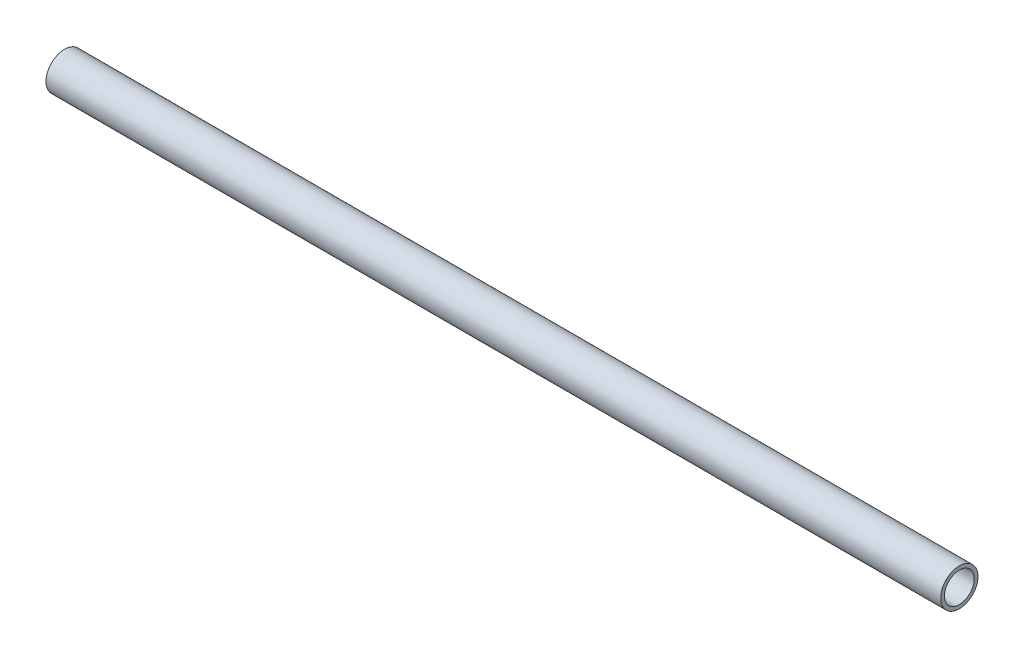
ISO-10303-21;
HEADER;
FILE_DESCRIPTION(('STEP AP214'),'2;1');
FILE_NAME('part.step','',(''),(''),'','','');
FILE_SCHEMA(('AUTOMOTIVE_DESIGN { 1 0 10303 214 1 1 1 1 }'));
ENDSEC;
DATA;
#1=APPLICATION_CONTEXT('core data for automotive mechanical design processes');
#2=APPLICATION_PROTOCOL_DEFINITION('international standard','automotive_design',2000,#1);
#3=PRODUCT_CONTEXT('',#1,'mechanical');
#4=PRODUCT('Part','Part','',(#3));
#5=PRODUCT_RELATED_PRODUCT_CATEGORY('part','',(#4));
#6=PRODUCT_DEFINITION_FORMATION('','',#4);
#7=PRODUCT_DEFINITION_CONTEXT('part definition',#1,'design');
#8=PRODUCT_DEFINITION('design','',#6,#7);
#9=PRODUCT_DEFINITION_SHAPE('','',#8);
#10=(LENGTH_UNIT() NAMED_UNIT(*) SI_UNIT(.MILLI.,.METRE.));
#11=(NAMED_UNIT(*) PLANE_ANGLE_UNIT() SI_UNIT($,.RADIAN.));
#12=(NAMED_UNIT(*) SI_UNIT($,.STERADIAN.) SOLID_ANGLE_UNIT());
#13=UNCERTAINTY_MEASURE_WITH_UNIT(LENGTH_MEASURE(1.E-05),#10,'distance_accuracy_value','');
#14=(GEOMETRIC_REPRESENTATION_CONTEXT(3) GLOBAL_UNCERTAINTY_ASSIGNED_CONTEXT((#13)) GLOBAL_UNIT_ASSIGNED_CONTEXT((#10,
#11,#12)) REPRESENTATION_CONTEXT('',''));
#15=CARTESIAN_POINT('',(0.,0.,0.));
#16=DIRECTION('',(0.,0.,1.));
#17=DIRECTION('',(1.,0.,0.));
#18=AXIS2_PLACEMENT_3D('',#15,#16,#17);
#19=CARTESIAN_POINT('',(190.5,0.,0.));
#20=DIRECTION('',(1.,0.,0.));
#21=DIRECTION('',(0.,0.,-1.));
#22=AXIS2_PLACEMENT_3D('',#19,#20,#21);
#23=PLANE('',#22);
#24=CARTESIAN_POINT('',(190.5,0.,0.));
#25=DIRECTION('',(1.,0.,0.));
#26=DIRECTION('',(0.,0.,-1.));
#27=AXIS2_PLACEMENT_3D('',#24,#25,#26);
#28=CIRCLE('',#27,7.9375);
#29=CARTESIAN_POINT('',(190.5,0.,-7.9375));
#30=VERTEX_POINT('',#29);
#31=EDGE_CURVE('E10',#30,#30,#28,.T.);
#32=ORIENTED_EDGE('',*,*,#31,.T.);
#33=EDGE_LOOP('',(#32));
#34=FACE_BOUND('',#33,.T.);
#35=CARTESIAN_POINT('',(190.5,0.,0.));
#36=DIRECTION('',(1.,0.,0.));
#37=DIRECTION('',(0.,0.,-1.));
#38=AXIS2_PLACEMENT_3D('',#35,#36,#37);
#39=CIRCLE('',#38,6.35);
#40=CARTESIAN_POINT('',(190.5,0.,-6.35));
#41=VERTEX_POINT('',#40);
#42=EDGE_CURVE('E54',#41,#41,#39,.T.);
#43=ORIENTED_EDGE('',*,*,#42,.F.);
#44=EDGE_LOOP('',(#43));
#45=FACE_BOUND('',#44,.T.);
#46=ADVANCED_FACE('F41',(#34,#45),#23,.T.);
#47=CARTESIAN_POINT('',(-190.5,0.,0.));
#48=DIRECTION('',(1.,0.,0.));
#49=DIRECTION('',(0.,0.,-1.));
#50=AXIS2_PLACEMENT_3D('',#47,#48,#49);
#51=PLANE('',#50);
#52=CARTESIAN_POINT('',(-190.5,0.,0.));
#53=DIRECTION('',(1.,0.,0.));
#54=DIRECTION('',(0.,0.,-1.));
#55=AXIS2_PLACEMENT_3D('',#52,#53,#54);
#56=CIRCLE('',#55,7.9375);
#57=CARTESIAN_POINT('',(-190.5,0.,-7.9375));
#58=VERTEX_POINT('',#57);
#59=EDGE_CURVE('E45',#58,#58,#56,.T.);
#60=ORIENTED_EDGE('',*,*,#59,.F.);
#61=EDGE_LOOP('',(#60));
#62=FACE_BOUND('',#61,.T.);
#63=CARTESIAN_POINT('',(-190.5,0.,0.));
#64=DIRECTION('',(1.,0.,0.));
#65=DIRECTION('',(0.,0.,-1.));
#66=AXIS2_PLACEMENT_3D('',#63,#64,#65);
#67=CIRCLE('',#66,6.35);
#68=CARTESIAN_POINT('',(-190.5,0.,-6.35));
#69=VERTEX_POINT('',#68);
#70=EDGE_CURVE('E56',#69,#69,#67,.T.);
#71=ORIENTED_EDGE('',*,*,#70,.T.);
#72=EDGE_LOOP('',(#71));
#73=FACE_BOUND('',#72,.T.);
#74=ADVANCED_FACE('F68',(#62,#73),#51,.F.);
#75=CARTESIAN_POINT('',(190.5,0.,0.));
#76=DIRECTION('',(-1.,0.,0.));
#77=DIRECTION('',(0.,0.,1.));
#78=AXIS2_PLACEMENT_3D('',#75,#76,#77);
#79=CYLINDRICAL_SURFACE('',#78,7.9375);
#80=ORIENTED_EDGE('',*,*,#31,.F.);
#81=EDGE_LOOP('',(#80));
#82=FACE_BOUND('',#81,.T.);
#83=ORIENTED_EDGE('',*,*,#59,.T.);
#84=EDGE_LOOP('',(#83));
#85=FACE_BOUND('',#84,.T.);
#86=ADVANCED_FACE('F43',(#82,#85),#79,.T.);
#87=CARTESIAN_POINT('',(190.5,0.,0.));
#88=DIRECTION('',(-1.,0.,0.));
#89=DIRECTION('',(0.,0.,1.));
#90=AXIS2_PLACEMENT_3D('',#87,#88,#89);
#91=CYLINDRICAL_SURFACE('',#90,6.35);
#92=ORIENTED_EDGE('',*,*,#42,.T.);
#93=EDGE_LOOP('',(#92));
#94=FACE_BOUND('',#93,.T.);
#95=ORIENTED_EDGE('',*,*,#70,.F.);
#96=EDGE_LOOP('',(#95));
#97=FACE_BOUND('',#96,.T.);
#98=ADVANCED_FACE('F64',(#94,#97),#91,.F.);
#99=CLOSED_SHELL('',(#46,#74,#86,#98));
#100=MANIFOLD_SOLID_BREP('B2',#99);
#101=ADVANCED_BREP_SHAPE_REPRESENTATION('',(#18,#100),#14);
#102=SHAPE_DEFINITION_REPRESENTATION(#9,#101);
ENDSEC;
END-ISO-10303-21;
